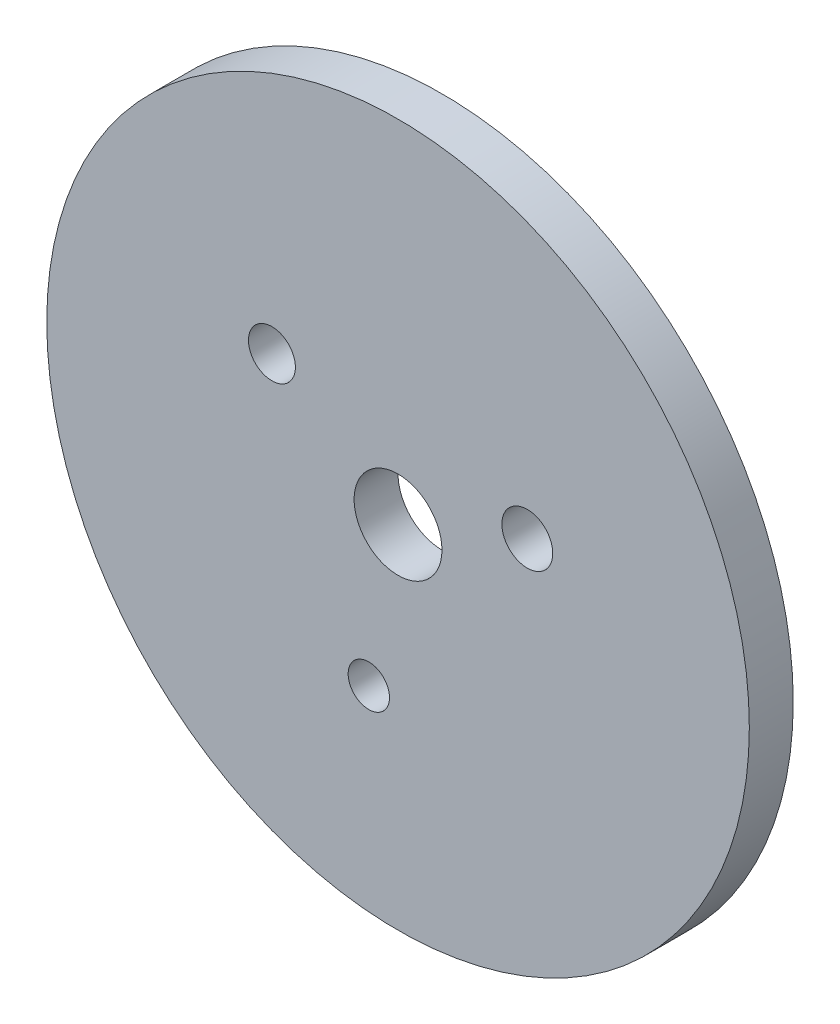
ISO-10303-21;
HEADER;
FILE_DESCRIPTION(('STEP AP214'),'2;1');
FILE_NAME('part.step','',(''),(''),'','','');
FILE_SCHEMA(('AUTOMOTIVE_DESIGN { 1 0 10303 214 1 1 1 1 }'));
ENDSEC;
DATA;
#1=APPLICATION_CONTEXT('core data for automotive mechanical design processes');
#2=APPLICATION_PROTOCOL_DEFINITION('international standard','automotive_design',2000,#1);
#3=PRODUCT_CONTEXT('',#1,'mechanical');
#4=PRODUCT('Part','Part','',(#3));
#5=PRODUCT_RELATED_PRODUCT_CATEGORY('part','',(#4));
#6=PRODUCT_DEFINITION_FORMATION('','',#4);
#7=PRODUCT_DEFINITION_CONTEXT('part definition',#1,'design');
#8=PRODUCT_DEFINITION('design','',#6,#7);
#9=PRODUCT_DEFINITION_SHAPE('','',#8);
#10=(LENGTH_UNIT() NAMED_UNIT(*) SI_UNIT(.MILLI.,.METRE.));
#11=(NAMED_UNIT(*) PLANE_ANGLE_UNIT() SI_UNIT($,.RADIAN.));
#12=(NAMED_UNIT(*) SI_UNIT($,.STERADIAN.) SOLID_ANGLE_UNIT());
#13=UNCERTAINTY_MEASURE_WITH_UNIT(LENGTH_MEASURE(1.E-05),#10,'distance_accuracy_value','');
#14=(GEOMETRIC_REPRESENTATION_CONTEXT(3) GLOBAL_UNCERTAINTY_ASSIGNED_CONTEXT((#13)) GLOBAL_UNIT_ASSIGNED_CONTEXT((#10,
#11,#12)) REPRESENTATION_CONTEXT('',''));
#15=CARTESIAN_POINT('',(0.,0.,0.));
#16=DIRECTION('',(0.,0.,1.));
#17=DIRECTION('',(1.,0.,0.));
#18=AXIS2_PLACEMENT_3D('',#15,#16,#17);
#19=CARTESIAN_POINT('',(0.,0.,3.175));
#20=DIRECTION('',(0.,0.,1.));
#21=DIRECTION('',(1.,0.,0.));
#22=AXIS2_PLACEMENT_3D('',#19,#20,#21);
#23=PLANE('',#22);
#24=CARTESIAN_POINT('',(-2.1134113956407,-11.1402832279168,3.175));
#25=DIRECTION('',(0.,0.,1.));
#26=DIRECTION('',(1.,0.,0.));
#27=AXIS2_PLACEMENT_3D('',#24,#25,#26);
#28=CIRCLE('',#27,1.49408993531548);
#29=CARTESIAN_POINT('',(-0.619321460325215,-11.1402832279168,3.175));
#30=VERTEX_POINT('',#29);
#31=EDGE_CURVE('E59',#30,#30,#28,.T.);
#32=ORIENTED_EDGE('',*,*,#31,.F.);
#33=EDGE_LOOP('',(#32));
#34=FACE_BOUND('',#33,.T.);
#35=CARTESIAN_POINT('',(9.34717125306861,3.79198915274515,3.175));
#36=DIRECTION('',(0.,0.,1.));
#37=DIRECTION('',(1.,0.,0.));
#38=AXIS2_PLACEMENT_3D('',#35,#36,#37);
#39=CIRCLE('',#38,1.83939433320099);
#40=CARTESIAN_POINT('',(11.1865655862696,3.79198915274515,3.175));
#41=VERTEX_POINT('',#40);
#42=EDGE_CURVE('E53',#41,#41,#39,.T.);
#43=ORIENTED_EDGE('',*,*,#42,.F.);
#44=EDGE_LOOP('',(#43));
#45=FACE_BOUND('',#44,.T.);
#46=CARTESIAN_POINT('',(-9.11889125228527,6.14587946586198,3.175));
#47=DIRECTION('',(0.,0.,1.));
#48=DIRECTION('',(1.,0.,0.));
#49=AXIS2_PLACEMENT_3D('',#46,#47,#48);
#50=CIRCLE('',#49,1.69764029775843);
#51=CARTESIAN_POINT('',(-7.42125095452684,6.14587946586198,3.175));
#52=VERTEX_POINT('',#51);
#53=EDGE_CURVE('E47',#52,#52,#50,.T.);
#54=ORIENTED_EDGE('',*,*,#53,.F.);
#55=EDGE_LOOP('',(#54));
#56=FACE_BOUND('',#55,.T.);
#57=CARTESIAN_POINT('',(0.,0.,3.175));
#58=DIRECTION('',(0.,0.,1.));
#59=DIRECTION('',(1.,0.,0.));
#60=AXIS2_PLACEMENT_3D('',#57,#58,#59);
#61=CIRCLE('',#60,25.4);
#62=CARTESIAN_POINT('',(25.4,0.,3.175));
#63=VERTEX_POINT('',#62);
#64=EDGE_CURVE('E10',#63,#63,#61,.T.);
#65=ORIENTED_EDGE('',*,*,#64,.T.);
#66=EDGE_LOOP('',(#65));
#67=FACE_BOUND('',#66,.T.);
#68=CARTESIAN_POINT('',(0.,0.,3.175));
#69=DIRECTION('',(0.,0.,1.));
#70=DIRECTION('',(1.,0.,0.));
#71=AXIS2_PLACEMENT_3D('',#68,#69,#70);
#72=CIRCLE('',#71,3.175);
#73=CARTESIAN_POINT('',(3.175,0.,3.175));
#74=VERTEX_POINT('',#73);
#75=EDGE_CURVE('E42',#74,#74,#72,.T.);
#76=ORIENTED_EDGE('',*,*,#75,.F.);
#77=EDGE_LOOP('',(#76));
#78=FACE_BOUND('',#77,.T.);
#79=ADVANCED_FACE('F31',(#34,#45,#56,#67,#78),#23,.T.);
#80=CARTESIAN_POINT('',(0.,0.,0.));
#81=DIRECTION('',(0.,0.,1.));
#82=DIRECTION('',(1.,0.,0.));
#83=AXIS2_PLACEMENT_3D('',#80,#81,#82);
#84=PLANE('',#83);
#85=CARTESIAN_POINT('',(-2.1134113956407,-11.1402832279168,0.));
#86=DIRECTION('',(0.,0.,1.));
#87=DIRECTION('',(1.,0.,0.));
#88=AXIS2_PLACEMENT_3D('',#85,#86,#87);
#89=CIRCLE('',#88,1.49408993531548);
#90=CARTESIAN_POINT('',(-0.619321460325215,-11.1402832279168,0.));
#91=VERTEX_POINT('',#90);
#92=EDGE_CURVE('E62',#91,#91,#89,.T.);
#93=ORIENTED_EDGE('',*,*,#92,.T.);
#94=EDGE_LOOP('',(#93));
#95=FACE_BOUND('',#94,.T.);
#96=CARTESIAN_POINT('',(9.34717125306861,3.79198915274515,0.));
#97=DIRECTION('',(0.,0.,1.));
#98=DIRECTION('',(1.,0.,0.));
#99=AXIS2_PLACEMENT_3D('',#96,#97,#98);
#100=CIRCLE('',#99,1.83939433320099);
#101=CARTESIAN_POINT('',(11.1865655862696,3.79198915274515,0.));
#102=VERTEX_POINT('',#101);
#103=EDGE_CURVE('E56',#102,#102,#100,.T.);
#104=ORIENTED_EDGE('',*,*,#103,.T.);
#105=EDGE_LOOP('',(#104));
#106=FACE_BOUND('',#105,.T.);
#107=CARTESIAN_POINT('',(-9.11889125228527,6.14587946586198,0.));
#108=DIRECTION('',(0.,0.,1.));
#109=DIRECTION('',(1.,0.,0.));
#110=AXIS2_PLACEMENT_3D('',#107,#108,#109);
#111=CIRCLE('',#110,1.69764029775843);
#112=CARTESIAN_POINT('',(-7.42125095452684,6.14587946586198,0.));
#113=VERTEX_POINT('',#112);
#114=EDGE_CURVE('E50',#113,#113,#111,.T.);
#115=ORIENTED_EDGE('',*,*,#114,.T.);
#116=EDGE_LOOP('',(#115));
#117=FACE_BOUND('',#116,.T.);
#118=CARTESIAN_POINT('',(0.,0.,0.));
#119=DIRECTION('',(0.,0.,1.));
#120=DIRECTION('',(1.,0.,0.));
#121=AXIS2_PLACEMENT_3D('',#118,#119,#120);
#122=CIRCLE('',#121,25.4);
#123=CARTESIAN_POINT('',(25.4,0.,0.));
#124=VERTEX_POINT('',#123);
#125=EDGE_CURVE('E35',#124,#124,#122,.T.);
#126=ORIENTED_EDGE('',*,*,#125,.F.);
#127=EDGE_LOOP('',(#126));
#128=FACE_BOUND('',#127,.T.);
#129=CARTESIAN_POINT('',(0.,0.,0.));
#130=DIRECTION('',(0.,0.,1.));
#131=DIRECTION('',(1.,0.,0.));
#132=AXIS2_PLACEMENT_3D('',#129,#130,#131);
#133=CIRCLE('',#132,3.175);
#134=CARTESIAN_POINT('',(3.175,0.,0.));
#135=VERTEX_POINT('',#134);
#136=EDGE_CURVE('E44',#135,#135,#133,.T.);
#137=ORIENTED_EDGE('',*,*,#136,.T.);
#138=EDGE_LOOP('',(#137));
#139=FACE_BOUND('',#138,.T.);
#140=ADVANCED_FACE('F73',(#95,#106,#117,#128,#139),#84,.F.);
#141=CARTESIAN_POINT('',(0.,0.,3.175));
#142=DIRECTION('',(0.,0.,-1.));
#143=DIRECTION('',(-1.,0.,0.));
#144=AXIS2_PLACEMENT_3D('',#141,#142,#143);
#145=CYLINDRICAL_SURFACE('',#144,25.4);
#146=ORIENTED_EDGE('',*,*,#64,.F.);
#147=EDGE_LOOP('',(#146));
#148=FACE_BOUND('',#147,.T.);
#149=ORIENTED_EDGE('',*,*,#125,.T.);
#150=EDGE_LOOP('',(#149));
#151=FACE_BOUND('',#150,.T.);
#152=ADVANCED_FACE('F33',(#148,#151),#145,.T.);
#153=CARTESIAN_POINT('',(0.,0.,3.175));
#154=DIRECTION('',(0.,0.,-1.));
#155=DIRECTION('',(-1.,0.,0.));
#156=AXIS2_PLACEMENT_3D('',#153,#154,#155);
#157=CYLINDRICAL_SURFACE('',#156,3.175);
#158=ORIENTED_EDGE('',*,*,#75,.T.);
#159=EDGE_LOOP('',(#158));
#160=FACE_BOUND('',#159,.T.);
#161=ORIENTED_EDGE('',*,*,#136,.F.);
#162=EDGE_LOOP('',(#161));
#163=FACE_BOUND('',#162,.T.);
#164=ADVANCED_FACE('F81',(#160,#163),#157,.F.);
#165=CARTESIAN_POINT('',(-9.11889125228527,6.14587946586198,3.175));
#166=DIRECTION('',(0.,0.,-1.));
#167=DIRECTION('',(-1.,0.,0.));
#168=AXIS2_PLACEMENT_3D('',#165,#166,#167);
#169=CYLINDRICAL_SURFACE('',#168,1.69764029775843);
#170=ORIENTED_EDGE('',*,*,#53,.T.);
#171=EDGE_LOOP('',(#170));
#172=FACE_BOUND('',#171,.T.);
#173=ORIENTED_EDGE('',*,*,#114,.F.);
#174=EDGE_LOOP('',(#173));
#175=FACE_BOUND('',#174,.T.);
#176=ADVANCED_FACE('F84',(#172,#175),#169,.F.);
#177=CARTESIAN_POINT('',(9.34717125306861,3.79198915274515,3.175));
#178=DIRECTION('',(0.,0.,-1.));
#179=DIRECTION('',(-1.,0.,0.));
#180=AXIS2_PLACEMENT_3D('',#177,#178,#179);
#181=CYLINDRICAL_SURFACE('',#180,1.83939433320099);
#182=ORIENTED_EDGE('',*,*,#42,.T.);
#183=EDGE_LOOP('',(#182));
#184=FACE_BOUND('',#183,.T.);
#185=ORIENTED_EDGE('',*,*,#103,.F.);
#186=EDGE_LOOP('',(#185));
#187=FACE_BOUND('',#186,.T.);
#188=ADVANCED_FACE('F98',(#184,#187),#181,.F.);
#189=CARTESIAN_POINT('',(-2.1134113956407,-11.1402832279168,3.175));
#190=DIRECTION('',(0.,0.,-1.));
#191=DIRECTION('',(-1.,0.,0.));
#192=AXIS2_PLACEMENT_3D('',#189,#190,#191);
#193=CYLINDRICAL_SURFACE('',#192,1.49408993531548);
#194=ORIENTED_EDGE('',*,*,#31,.T.);
#195=EDGE_LOOP('',(#194));
#196=FACE_BOUND('',#195,.T.);
#197=ORIENTED_EDGE('',*,*,#92,.F.);
#198=EDGE_LOOP('',(#197));
#199=FACE_BOUND('',#198,.T.);
#200=ADVANCED_FACE('F68',(#196,#199),#193,.F.);
#201=CLOSED_SHELL('',(#79,#140,#152,#164,#176,#188,#200));
#202=MANIFOLD_SOLID_BREP('B2',#201);
#203=ADVANCED_BREP_SHAPE_REPRESENTATION('',(#18,#202),#14);
#204=SHAPE_DEFINITION_REPRESENTATION(#9,#203);
ENDSEC;
END-ISO-10303-21;
